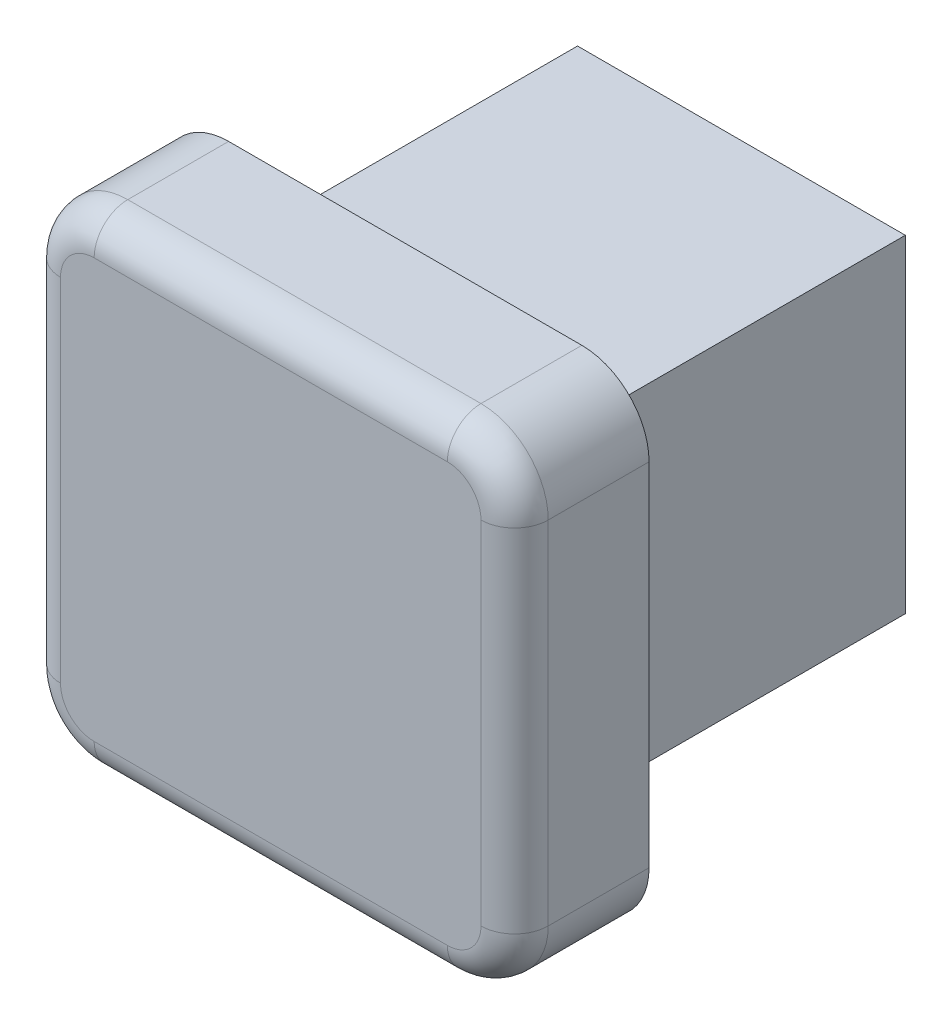
ISO-10303-21;
HEADER;
FILE_DESCRIPTION(('STEP AP214'),'2;1');
FILE_NAME('part.step','',(''),(''),'','','');
FILE_SCHEMA(('AUTOMOTIVE_DESIGN { 1 0 10303 214 1 1 1 1 }'));
ENDSEC;
DATA;
#1=APPLICATION_CONTEXT('core data for automotive mechanical design processes');
#2=APPLICATION_PROTOCOL_DEFINITION('international standard','automotive_design',2000,#1);
#3=PRODUCT_CONTEXT('',#1,'mechanical');
#4=PRODUCT('Part','Part','',(#3));
#5=PRODUCT_RELATED_PRODUCT_CATEGORY('part','',(#4));
#6=PRODUCT_DEFINITION_FORMATION('','',#4);
#7=PRODUCT_DEFINITION_CONTEXT('part definition',#1,'design');
#8=PRODUCT_DEFINITION('design','',#6,#7);
#9=PRODUCT_DEFINITION_SHAPE('','',#8);
#10=(LENGTH_UNIT() NAMED_UNIT(*) SI_UNIT(.MILLI.,.METRE.));
#11=(NAMED_UNIT(*) PLANE_ANGLE_UNIT() SI_UNIT($,.RADIAN.));
#12=(NAMED_UNIT(*) SI_UNIT($,.STERADIAN.) SOLID_ANGLE_UNIT());
#13=UNCERTAINTY_MEASURE_WITH_UNIT(LENGTH_MEASURE(1.E-05),#10,'distance_accuracy_value','');
#14=(GEOMETRIC_REPRESENTATION_CONTEXT(3) GLOBAL_UNCERTAINTY_ASSIGNED_CONTEXT((#13)) GLOBAL_UNIT_ASSIGNED_CONTEXT((#10,
#11,#12)) REPRESENTATION_CONTEXT('',''));
#15=CARTESIAN_POINT('',(0.,0.,0.));
#16=DIRECTION('',(0.,0.,1.));
#17=DIRECTION('',(1.,0.,0.));
#18=AXIS2_PLACEMENT_3D('',#15,#16,#17);
#19=CARTESIAN_POINT('',(0.,0.,0.));
#20=DIRECTION('',(0.,0.,1.));
#21=DIRECTION('',(1.,0.,0.));
#22=AXIS2_PLACEMENT_3D('',#19,#20,#21);
#23=PLANE('',#22);
#24=DIRECTION('',(0.,-1.,0.));
#25=VECTOR('',#24,1.);
#26=CARTESIAN_POINT('',(-4.875,4.875,0.));
#27=LINE('',#26,#25);
#28=CARTESIAN_POINT('',(-4.875,4.875,0.));
#29=VERTEX_POINT('',#28);
#30=CARTESIAN_POINT('',(-4.875,-4.875,0.));
#31=VERTEX_POINT('',#30);
#32=EDGE_CURVE('E280',#29,#31,#27,.T.);
#33=ORIENTED_EDGE('',*,*,#32,.F.);
#34=DIRECTION('',(1.,0.,0.));
#35=VECTOR('',#34,1.);
#36=CARTESIAN_POINT('',(-4.875,4.875,0.));
#37=LINE('',#36,#35);
#38=CARTESIAN_POINT('',(4.875,4.875,0.));
#39=VERTEX_POINT('',#38);
#40=EDGE_CURVE('E284',#29,#39,#37,.T.);
#41=ORIENTED_EDGE('',*,*,#40,.T.);
#42=DIRECTION('',(0.,-1.,0.));
#43=VECTOR('',#42,1.);
#44=CARTESIAN_POINT('',(4.875,4.875,0.));
#45=LINE('',#44,#43);
#46=CARTESIAN_POINT('',(4.875,-4.875,0.));
#47=VERTEX_POINT('',#46);
#48=EDGE_CURVE('E298',#39,#47,#45,.T.);
#49=ORIENTED_EDGE('',*,*,#48,.T.);
#50=DIRECTION('',(1.,0.,0.));
#51=VECTOR('',#50,1.);
#52=CARTESIAN_POINT('',(-4.875,-4.875,0.));
#53=LINE('',#52,#51);
#54=EDGE_CURVE('E295',#31,#47,#53,.T.);
#55=ORIENTED_EDGE('',*,*,#54,.F.);
#56=EDGE_LOOP('',(#33,#41,#49,#55));
#57=FACE_BOUND('',#56,.T.);
#58=DIRECTION('',(0.,-1.,0.));
#59=VECTOR('',#58,1.);
#60=CARTESIAN_POINT('',(-3.875,3.875,0.));
#61=LINE('',#60,#59);
#62=CARTESIAN_POINT('',(-3.875,3.875,0.));
#63=VERTEX_POINT('',#62);
#64=CARTESIAN_POINT('',(-3.875,-3.875,0.));
#65=VERTEX_POINT('',#64);
#66=EDGE_CURVE('E201',#63,#65,#61,.T.);
#67=ORIENTED_EDGE('',*,*,#66,.T.);
#68=DIRECTION('',(1.,0.,0.));
#69=VECTOR('',#68,1.);
#70=CARTESIAN_POINT('',(-3.875,-3.875,0.));
#71=LINE('',#70,#69);
#72=CARTESIAN_POINT('',(3.875,-3.875,0.));
#73=VERTEX_POINT('',#72);
#74=EDGE_CURVE('E263',#65,#73,#71,.T.);
#75=ORIENTED_EDGE('',*,*,#74,.T.);
#76=DIRECTION('',(0.,-1.,0.));
#77=VECTOR('',#76,1.);
#78=CARTESIAN_POINT('',(3.875,3.875,0.));
#79=LINE('',#78,#77);
#80=CARTESIAN_POINT('',(3.875,3.875,0.));
#81=VERTEX_POINT('',#80);
#82=EDGE_CURVE('E266',#81,#73,#79,.T.);
#83=ORIENTED_EDGE('',*,*,#82,.F.);
#84=DIRECTION('',(1.,0.,0.));
#85=VECTOR('',#84,1.);
#86=CARTESIAN_POINT('',(-3.875,3.875,0.));
#87=LINE('',#86,#85);
#88=EDGE_CURVE('E251',#63,#81,#87,.T.);
#89=ORIENTED_EDGE('',*,*,#88,.F.);
#90=EDGE_LOOP('',(#67,#75,#83,#89));
#91=FACE_BOUND('',#90,.T.);
#92=ADVANCED_FACE('F57',(#57,#91),#23,.F.);
#93=CARTESIAN_POINT('',(-4.875,4.875,10.));
#94=DIRECTION('',(1.,0.,0.));
#95=DIRECTION('',(0.,1.,0.));
#96=AXIS2_PLACEMENT_3D('',#93,#94,#95);
#97=PLANE('',#96);
#98=ORIENTED_EDGE('',*,*,#32,.T.);
#99=DIRECTION('',(0.,0.,-1.));
#100=VECTOR('',#99,1.);
#101=CARTESIAN_POINT('',(-4.875,-4.875,10.));
#102=LINE('',#101,#100);
#103=CARTESIAN_POINT('',(-4.875,-4.875,10.));
#104=VERTEX_POINT('',#103);
#105=EDGE_CURVE('E308',#104,#31,#102,.T.);
#106=ORIENTED_EDGE('',*,*,#105,.F.);
#107=DIRECTION('',(0.,-1.,0.));
#108=VECTOR('',#107,1.);
#109=CARTESIAN_POINT('',(-4.875,4.875,10.));
#110=LINE('',#109,#108);
#111=CARTESIAN_POINT('',(-4.875,4.875,10.));
#112=VERTEX_POINT('',#111);
#113=EDGE_CURVE('E281',#112,#104,#110,.T.);
#114=ORIENTED_EDGE('',*,*,#113,.F.);
#115=DIRECTION('',(0.,0.,-1.));
#116=VECTOR('',#115,1.);
#117=CARTESIAN_POINT('',(-4.875,4.875,10.));
#118=LINE('',#117,#116);
#119=EDGE_CURVE('E292',#112,#29,#118,.T.);
#120=ORIENTED_EDGE('',*,*,#119,.T.);
#121=EDGE_LOOP('',(#98,#106,#114,#120));
#122=FACE_BOUND('',#121,.T.);
#123=ADVANCED_FACE('F422',(#122),#97,.F.);
#124=CARTESIAN_POINT('',(-4.875,-4.875,10.));
#125=DIRECTION('',(0.,1.,0.));
#126=DIRECTION('',(-1.,0.,0.));
#127=AXIS2_PLACEMENT_3D('',#124,#125,#126);
#128=PLANE('',#127);
#129=ORIENTED_EDGE('',*,*,#54,.T.);
#130=DIRECTION('',(0.,0.,-1.));
#131=VECTOR('',#130,1.);
#132=CARTESIAN_POINT('',(4.875,-4.875,10.));
#133=LINE('',#132,#131);
#134=CARTESIAN_POINT('',(4.875,-4.875,10.));
#135=VERTEX_POINT('',#134);
#136=EDGE_CURVE('E306',#135,#47,#133,.T.);
#137=ORIENTED_EDGE('',*,*,#136,.F.);
#138=DIRECTION('',(1.,0.,0.));
#139=VECTOR('',#138,1.);
#140=CARTESIAN_POINT('',(-4.875,-4.875,10.));
#141=LINE('',#140,#139);
#142=EDGE_CURVE('E283',#104,#135,#141,.T.);
#143=ORIENTED_EDGE('',*,*,#142,.F.);
#144=ORIENTED_EDGE('',*,*,#105,.T.);
#145=EDGE_LOOP('',(#129,#137,#143,#144));
#146=FACE_BOUND('',#145,.T.);
#147=ADVANCED_FACE('F428',(#146),#128,.F.);
#148=CARTESIAN_POINT('',(4.875,4.875,10.));
#149=DIRECTION('',(1.,0.,0.));
#150=DIRECTION('',(0.,0.,-1.));
#151=AXIS2_PLACEMENT_3D('',#148,#149,#150);
#152=PLANE('',#151);
#153=ORIENTED_EDGE('',*,*,#48,.F.);
#154=DIRECTION('',(0.,0.,-1.));
#155=VECTOR('',#154,1.);
#156=CARTESIAN_POINT('',(4.875,4.875,10.));
#157=LINE('',#156,#155);
#158=CARTESIAN_POINT('',(4.875,4.875,10.));
#159=VERTEX_POINT('',#158);
#160=EDGE_CURVE('E304',#159,#39,#157,.T.);
#161=ORIENTED_EDGE('',*,*,#160,.F.);
#162=DIRECTION('',(0.,-1.,0.));
#163=VECTOR('',#162,1.);
#164=CARTESIAN_POINT('',(4.875,4.875,10.));
#165=LINE('',#164,#163);
#166=EDGE_CURVE('E286',#159,#135,#165,.T.);
#167=ORIENTED_EDGE('',*,*,#166,.T.);
#168=ORIENTED_EDGE('',*,*,#136,.T.);
#169=EDGE_LOOP('',(#153,#161,#167,#168));
#170=FACE_BOUND('',#169,.T.);
#171=ADVANCED_FACE('F440',(#170),#152,.T.);
#172=CARTESIAN_POINT('',(-4.875,4.875,10.));
#173=DIRECTION('',(0.,1.,0.));
#174=DIRECTION('',(0.,0.,1.));
#175=AXIS2_PLACEMENT_3D('',#172,#173,#174);
#176=PLANE('',#175);
#177=ORIENTED_EDGE('',*,*,#40,.F.);
#178=ORIENTED_EDGE('',*,*,#119,.F.);
#179=DIRECTION('',(1.,0.,0.));
#180=VECTOR('',#179,1.);
#181=CARTESIAN_POINT('',(-4.875,4.875,10.));
#182=LINE('',#181,#180);
#183=EDGE_CURVE('E289',#112,#159,#182,.T.);
#184=ORIENTED_EDGE('',*,*,#183,.T.);
#185=ORIENTED_EDGE('',*,*,#160,.T.);
#186=EDGE_LOOP('',(#177,#178,#184,#185));
#187=FACE_BOUND('',#186,.T.);
#188=ADVANCED_FACE('F437',(#187),#176,.T.);
#189=CARTESIAN_POINT('',(-3.875,3.875,10.));
#190=DIRECTION('',(1.,0.,0.));
#191=DIRECTION('',(0.,1.,0.));
#192=AXIS2_PLACEMENT_3D('',#189,#190,#191);
#193=PLANE('',#192);
#194=ORIENTED_EDGE('',*,*,#66,.F.);
#195=DIRECTION('',(0.,0.,-1.));
#196=VECTOR('',#195,1.);
#197=CARTESIAN_POINT('',(-3.875,3.875,10.));
#198=LINE('',#197,#196);
#199=CARTESIAN_POINT('',(-3.875,3.875,10.));
#200=VERTEX_POINT('',#199);
#201=EDGE_CURVE('E260',#200,#63,#198,.T.);
#202=ORIENTED_EDGE('',*,*,#201,.F.);
#203=DIRECTION('',(0.,-1.,0.));
#204=VECTOR('',#203,1.);
#205=CARTESIAN_POINT('',(-3.875,3.875,10.));
#206=LINE('',#205,#204);
#207=CARTESIAN_POINT('',(-3.875,-3.875,10.));
#208=VERTEX_POINT('',#207);
#209=EDGE_CURVE('E248',#200,#208,#206,.T.);
#210=ORIENTED_EDGE('',*,*,#209,.T.);
#211=DIRECTION('',(0.,0.,-1.));
#212=VECTOR('',#211,1.);
#213=CARTESIAN_POINT('',(-3.875,-3.875,10.));
#214=LINE('',#213,#212);
#215=EDGE_CURVE('E277',#208,#65,#214,.T.);
#216=ORIENTED_EDGE('',*,*,#215,.T.);
#217=EDGE_LOOP('',(#194,#202,#210,#216));
#218=FACE_BOUND('',#217,.T.);
#219=ADVANCED_FACE('F435',(#218),#193,.T.);
#220=CARTESIAN_POINT('',(-3.875,-3.875,10.));
#221=DIRECTION('',(0.,1.,0.));
#222=DIRECTION('',(0.,0.,1.));
#223=AXIS2_PLACEMENT_3D('',#220,#221,#222);
#224=PLANE('',#223);
#225=ORIENTED_EDGE('',*,*,#74,.F.);
#226=ORIENTED_EDGE('',*,*,#215,.F.);
#227=DIRECTION('',(1.,0.,0.));
#228=VECTOR('',#227,1.);
#229=CARTESIAN_POINT('',(-3.875,-3.875,10.));
#230=LINE('',#229,#228);
#231=CARTESIAN_POINT('',(3.875,-3.875,10.));
#232=VERTEX_POINT('',#231);
#233=EDGE_CURVE('E250',#208,#232,#230,.T.);
#234=ORIENTED_EDGE('',*,*,#233,.T.);
#235=DIRECTION('',(0.,0.,-1.));
#236=VECTOR('',#235,1.);
#237=CARTESIAN_POINT('',(3.875,-3.875,10.));
#238=LINE('',#237,#236);
#239=EDGE_CURVE('E275',#232,#73,#238,.T.);
#240=ORIENTED_EDGE('',*,*,#239,.T.);
#241=EDGE_LOOP('',(#225,#226,#234,#240));
#242=FACE_BOUND('',#241,.T.);
#243=ADVANCED_FACE('F489',(#242),#224,.T.);
#244=CARTESIAN_POINT('',(3.875,3.875,10.));
#245=DIRECTION('',(1.,0.,0.));
#246=DIRECTION('',(0.,1.,0.));
#247=AXIS2_PLACEMENT_3D('',#244,#245,#246);
#248=PLANE('',#247);
#249=ORIENTED_EDGE('',*,*,#82,.T.);
#250=ORIENTED_EDGE('',*,*,#239,.F.);
#251=DIRECTION('',(0.,-1.,0.));
#252=VECTOR('',#251,1.);
#253=CARTESIAN_POINT('',(3.875,3.875,10.));
#254=LINE('',#253,#252);
#255=CARTESIAN_POINT('',(3.875,3.875,10.));
#256=VERTEX_POINT('',#255);
#257=EDGE_CURVE('E254',#256,#232,#254,.T.);
#258=ORIENTED_EDGE('',*,*,#257,.F.);
#259=DIRECTION('',(0.,0.,-1.));
#260=VECTOR('',#259,1.);
#261=CARTESIAN_POINT('',(3.875,3.875,10.));
#262=LINE('',#261,#260);
#263=EDGE_CURVE('E273',#256,#81,#262,.T.);
#264=ORIENTED_EDGE('',*,*,#263,.T.);
#265=EDGE_LOOP('',(#249,#250,#258,#264));
#266=FACE_BOUND('',#265,.T.);
#267=ADVANCED_FACE('F482',(#266),#248,.F.);
#268=CARTESIAN_POINT('',(-3.875,3.875,10.));
#269=DIRECTION('',(0.,1.,0.));
#270=DIRECTION('',(0.,0.,1.));
#271=AXIS2_PLACEMENT_3D('',#268,#269,#270);
#272=PLANE('',#271);
#273=ORIENTED_EDGE('',*,*,#88,.T.);
#274=ORIENTED_EDGE('',*,*,#263,.F.);
#275=DIRECTION('',(1.,0.,0.));
#276=VECTOR('',#275,1.);
#277=CARTESIAN_POINT('',(-3.875,3.875,10.));
#278=LINE('',#277,#276);
#279=EDGE_CURVE('E257',#200,#256,#278,.T.);
#280=ORIENTED_EDGE('',*,*,#279,.F.);
#281=ORIENTED_EDGE('',*,*,#201,.T.);
#282=EDGE_LOOP('',(#273,#274,#280,#281));
#283=FACE_BOUND('',#282,.T.);
#284=ADVANCED_FACE('F475',(#283),#272,.F.);
#285=CARTESIAN_POINT('',(5.25316108936624,5.22871627776556,10.));
#286=DIRECTION('',(0.,0.,-1.));
#287=DIRECTION('',(-1.,0.,0.));
#288=AXIS2_PLACEMENT_3D('',#285,#286,#287);
#289=PLANE('',#288);
#290=ORIENTED_EDGE('',*,*,#233,.F.);
#291=ORIENTED_EDGE('',*,*,#209,.F.);
#292=ORIENTED_EDGE('',*,*,#279,.T.);
#293=ORIENTED_EDGE('',*,*,#257,.T.);
#294=EDGE_LOOP('',(#290,#291,#292,#293));
#295=FACE_BOUND('',#294,.T.);
#296=ADVANCED_FACE('F468',(#295),#289,.T.);
#297=CARTESIAN_POINT('',(5.25316108936624,5.22871627776556,14.));
#298=DIRECTION('',(0.,0.,-1.));
#299=DIRECTION('',(-1.,0.,0.));
#300=AXIS2_PLACEMENT_3D('',#297,#298,#299);
#301=CYLINDRICAL_SURFACE('',#300,2.);
#302=DIRECTION('',(0.,0.,-1.));
#303=VECTOR('',#302,1.);
#304=CARTESIAN_POINT('',(5.25316108936623,7.22871627776556,14.));
#305=LINE('',#304,#303);
#306=CARTESIAN_POINT('',(5.25316108936623,7.22871627776556,13.));
#307=VERTEX_POINT('',#306);
#308=CARTESIAN_POINT('',(5.25316108936623,7.22871627776556,10.));
#309=VERTEX_POINT('',#308);
#310=EDGE_CURVE('E193',#307,#309,#305,.T.);
#311=ORIENTED_EDGE('',*,*,#310,.F.);
#312=CARTESIAN_POINT('',(5.25316108936624,5.22871627776556,13.));
#313=DIRECTION('',(0.,0.,-1.));
#314=DIRECTION('',(-1.,0.,0.));
#315=AXIS2_PLACEMENT_3D('',#312,#313,#314);
#316=CIRCLE('',#315,2.);
#317=CARTESIAN_POINT('',(7.25316108936624,5.22871627776554,13.));
#318=VERTEX_POINT('',#317);
#319=EDGE_CURVE('E12',#307,#318,#316,.T.);
#320=ORIENTED_EDGE('',*,*,#319,.T.);
#321=DIRECTION('',(0.,0.,-1.));
#322=VECTOR('',#321,1.);
#323=CARTESIAN_POINT('',(7.25316108936624,5.22871627776554,14.));
#324=LINE('',#323,#322);
#325=CARTESIAN_POINT('',(7.25316108936624,5.22871627776554,10.));
#326=VERTEX_POINT('',#325);
#327=EDGE_CURVE('E215',#318,#326,#324,.T.);
#328=ORIENTED_EDGE('',*,*,#327,.T.);
#329=CARTESIAN_POINT('',(5.25316108936624,5.22871627776556,10.));
#330=DIRECTION('',(0.,0.,1.));
#331=DIRECTION('',(-1.,0.,0.));
#332=AXIS2_PLACEMENT_3D('',#329,#330,#331);
#333=CIRCLE('',#332,2.);
#334=EDGE_CURVE('E208',#326,#309,#333,.T.);
#335=ORIENTED_EDGE('',*,*,#334,.T.);
#336=EDGE_LOOP('',(#311,#320,#328,#335));
#337=FACE_BOUND('',#336,.T.);
#338=ADVANCED_FACE('F213',(#337),#301,.T.);
#339=CARTESIAN_POINT('',(-5.25316108936623,7.22871627776556,14.));
#340=DIRECTION('',(0.,-1.,0.));
#341=DIRECTION('',(0.,0.,-1.));
#342=AXIS2_PLACEMENT_3D('',#339,#340,#341);
#343=PLANE('',#342);
#344=DIRECTION('',(0.,0.,-1.));
#345=VECTOR('',#344,1.);
#346=CARTESIAN_POINT('',(-5.25316108936623,7.22871627776556,14.));
#347=LINE('',#346,#345);
#348=CARTESIAN_POINT('',(-5.25316108936623,7.22871627776556,13.));
#349=VERTEX_POINT('',#348);
#350=CARTESIAN_POINT('',(-5.25316108936623,7.22871627776556,10.));
#351=VERTEX_POINT('',#350);
#352=EDGE_CURVE('E202',#349,#351,#347,.T.);
#353=ORIENTED_EDGE('',*,*,#352,.F.);
#354=DIRECTION('',(-1.,0.,0.));
#355=VECTOR('',#354,1.);
#356=CARTESIAN_POINT('',(-5.25316108936623,7.22871627776556,13.));
#357=LINE('',#356,#355);
#358=EDGE_CURVE('E66',#349,#307,#357,.F.);
#359=ORIENTED_EDGE('',*,*,#358,.T.);
#360=ORIENTED_EDGE('',*,*,#310,.T.);
#361=DIRECTION('',(-1.,0.,0.));
#362=VECTOR('',#361,1.);
#363=CARTESIAN_POINT('',(-5.25316108936623,7.22871627776556,10.));
#364=LINE('',#363,#362);
#365=EDGE_CURVE('E196',#309,#351,#364,.T.);
#366=ORIENTED_EDGE('',*,*,#365,.T.);
#367=EDGE_LOOP('',(#353,#359,#360,#366));
#368=FACE_BOUND('',#367,.T.);
#369=ADVANCED_FACE('F195',(#368),#343,.F.);
#370=CARTESIAN_POINT('',(-5.25316108936624,5.22871627776556,14.));
#371=DIRECTION('',(0.,0.,-1.));
#372=DIRECTION('',(-1.,0.,0.));
#373=AXIS2_PLACEMENT_3D('',#370,#371,#372);
#374=CYLINDRICAL_SURFACE('',#373,2.);
#375=DIRECTION('',(0.,0.,-1.));
#376=VECTOR('',#375,1.);
#377=CARTESIAN_POINT('',(-7.25316108936624,5.22871627776554,14.));
#378=LINE('',#377,#376);
#379=CARTESIAN_POINT('',(-7.25316108936624,5.22871627776554,13.));
#380=VERTEX_POINT('',#379);
#381=CARTESIAN_POINT('',(-7.25316108936624,5.22871627776554,10.));
#382=VERTEX_POINT('',#381);
#383=EDGE_CURVE('E245',#380,#382,#378,.T.);
#384=ORIENTED_EDGE('',*,*,#383,.F.);
#385=CARTESIAN_POINT('',(-5.25316108936624,5.22871627776556,13.));
#386=DIRECTION('',(0.,0.,-1.));
#387=DIRECTION('',(-1.,0.,0.));
#388=AXIS2_PLACEMENT_3D('',#385,#386,#387);
#389=CIRCLE('',#388,2.);
#390=EDGE_CURVE('E81',#380,#349,#389,.T.);
#391=ORIENTED_EDGE('',*,*,#390,.T.);
#392=ORIENTED_EDGE('',*,*,#352,.T.);
#393=CARTESIAN_POINT('',(-5.25316108936624,5.22871627776556,10.));
#394=DIRECTION('',(0.,0.,1.));
#395=DIRECTION('',(1.,0.,0.));
#396=AXIS2_PLACEMENT_3D('',#393,#394,#395);
#397=CIRCLE('',#396,2.);
#398=EDGE_CURVE('E211',#351,#382,#397,.T.);
#399=ORIENTED_EDGE('',*,*,#398,.T.);
#400=EDGE_LOOP('',(#384,#391,#392,#399));
#401=FACE_BOUND('',#400,.T.);
#402=ADVANCED_FACE('F412',(#401),#374,.T.);
#403=CARTESIAN_POINT('',(-7.25316108936624,5.22871627776554,14.));
#404=DIRECTION('',(1.,0.,0.));
#405=DIRECTION('',(0.,0.,-1.));
#406=AXIS2_PLACEMENT_3D('',#403,#404,#405);
#407=PLANE('',#406);
#408=DIRECTION('',(0.,0.,-1.));
#409=VECTOR('',#408,1.);
#410=CARTESIAN_POINT('',(-7.25316108936624,-5.22871627776554,14.));
#411=LINE('',#410,#409);
#412=CARTESIAN_POINT('',(-7.25316108936624,-5.22871627776554,13.));
#413=VERTEX_POINT('',#412);
#414=CARTESIAN_POINT('',(-7.25316108936624,-5.22871627776554,10.));
#415=VERTEX_POINT('',#414);
#416=EDGE_CURVE('E243',#413,#415,#411,.T.);
#417=ORIENTED_EDGE('',*,*,#416,.F.);
#418=DIRECTION('',(0.,-1.,0.));
#419=VECTOR('',#418,1.);
#420=CARTESIAN_POINT('',(-7.25316108936624,5.22871627776554,13.));
#421=LINE('',#420,#419);
#422=EDGE_CURVE('E337',#413,#380,#421,.F.);
#423=ORIENTED_EDGE('',*,*,#422,.T.);
#424=ORIENTED_EDGE('',*,*,#383,.T.);
#425=DIRECTION('',(0.,-1.,0.));
#426=VECTOR('',#425,1.);
#427=CARTESIAN_POINT('',(-7.25316108936624,5.22871627776554,10.));
#428=LINE('',#427,#426);
#429=EDGE_CURVE('E222',#382,#415,#428,.T.);
#430=ORIENTED_EDGE('',*,*,#429,.T.);
#431=EDGE_LOOP('',(#417,#423,#424,#430));
#432=FACE_BOUND('',#431,.T.);
#433=ADVANCED_FACE('F410',(#432),#407,.F.);
#434=CARTESIAN_POINT('',(-5.25316108936624,-5.22871627776556,14.));
#435=DIRECTION('',(0.,0.,-1.));
#436=DIRECTION('',(-1.,0.,0.));
#437=AXIS2_PLACEMENT_3D('',#434,#435,#436);
#438=CYLINDRICAL_SURFACE('',#437,2.);
#439=DIRECTION('',(0.,0.,-1.));
#440=VECTOR('',#439,1.);
#441=CARTESIAN_POINT('',(-5.25316108936623,-7.22871627776556,14.));
#442=LINE('',#441,#440);
#443=CARTESIAN_POINT('',(-5.25316108936623,-7.22871627776556,13.));
#444=VERTEX_POINT('',#443);
#445=CARTESIAN_POINT('',(-5.25316108936623,-7.22871627776556,10.));
#446=VERTEX_POINT('',#445);
#447=EDGE_CURVE('E241',#444,#446,#442,.T.);
#448=ORIENTED_EDGE('',*,*,#447,.F.);
#449=CARTESIAN_POINT('',(-5.25316108936624,-5.22871627776556,13.));
#450=DIRECTION('',(0.,0.,-1.));
#451=DIRECTION('',(-1.,0.,0.));
#452=AXIS2_PLACEMENT_3D('',#449,#450,#451);
#453=CIRCLE('',#452,2.);
#454=EDGE_CURVE('E335',#444,#413,#453,.T.);
#455=ORIENTED_EDGE('',*,*,#454,.T.);
#456=ORIENTED_EDGE('',*,*,#416,.T.);
#457=CARTESIAN_POINT('',(-5.25316108936624,-5.22871627776556,10.));
#458=DIRECTION('',(0.,0.,1.));
#459=DIRECTION('',(1.,0.,0.));
#460=AXIS2_PLACEMENT_3D('',#457,#458,#459);
#461=CIRCLE('',#460,2.);
#462=EDGE_CURVE('E225',#415,#446,#461,.T.);
#463=ORIENTED_EDGE('',*,*,#462,.T.);
#464=EDGE_LOOP('',(#448,#455,#456,#463));
#465=FACE_BOUND('',#464,.T.);
#466=ADVANCED_FACE('F408',(#465),#438,.T.);
#467=CARTESIAN_POINT('',(-5.25316108936623,-7.22871627776556,14.));
#468=DIRECTION('',(0.,1.,0.));
#469=DIRECTION('',(0.,0.,1.));
#470=AXIS2_PLACEMENT_3D('',#467,#468,#469);
#471=PLANE('',#470);
#472=DIRECTION('',(0.,0.,-1.));
#473=VECTOR('',#472,1.);
#474=CARTESIAN_POINT('',(5.25316108936623,-7.22871627776556,14.));
#475=LINE('',#474,#473);
#476=CARTESIAN_POINT('',(5.25316108936623,-7.22871627776556,13.));
#477=VERTEX_POINT('',#476);
#478=CARTESIAN_POINT('',(5.25316108936623,-7.22871627776556,10.));
#479=VERTEX_POINT('',#478);
#480=EDGE_CURVE('E239',#477,#479,#475,.T.);
#481=ORIENTED_EDGE('',*,*,#480,.F.);
#482=DIRECTION('',(1.,0.,0.));
#483=VECTOR('',#482,1.);
#484=CARTESIAN_POINT('',(-5.25316108936623,-7.22871627776556,13.));
#485=LINE('',#484,#483);
#486=EDGE_CURVE('E333',#477,#444,#485,.F.);
#487=ORIENTED_EDGE('',*,*,#486,.T.);
#488=ORIENTED_EDGE('',*,*,#447,.T.);
#489=DIRECTION('',(1.,0.,0.));
#490=VECTOR('',#489,1.);
#491=CARTESIAN_POINT('',(-5.25316108936623,-7.22871627776556,10.));
#492=LINE('',#491,#490);
#493=EDGE_CURVE('E228',#446,#479,#492,.T.);
#494=ORIENTED_EDGE('',*,*,#493,.T.);
#495=EDGE_LOOP('',(#481,#487,#488,#494));
#496=FACE_BOUND('',#495,.T.);
#497=ADVANCED_FACE('F396',(#496),#471,.F.);
#498=CARTESIAN_POINT('',(5.25316108936624,-5.22871627776556,14.));
#499=DIRECTION('',(0.,0.,-1.));
#500=DIRECTION('',(-1.,0.,0.));
#501=AXIS2_PLACEMENT_3D('',#498,#499,#500);
#502=CYLINDRICAL_SURFACE('',#501,2.);
#503=DIRECTION('',(0.,0.,-1.));
#504=VECTOR('',#503,1.);
#505=CARTESIAN_POINT('',(7.25316108936624,-5.22871627776556,14.));
#506=LINE('',#505,#504);
#507=CARTESIAN_POINT('',(7.25316108936624,-5.22871627776556,13.));
#508=VERTEX_POINT('',#507);
#509=CARTESIAN_POINT('',(7.25316108936624,-5.22871627776556,10.));
#510=VERTEX_POINT('',#509);
#511=EDGE_CURVE('E237',#508,#510,#506,.T.);
#512=ORIENTED_EDGE('',*,*,#511,.F.);
#513=CARTESIAN_POINT('',(5.25316108936624,-5.22871627776556,13.));
#514=DIRECTION('',(0.,0.,-1.));
#515=DIRECTION('',(-1.,0.,0.));
#516=AXIS2_PLACEMENT_3D('',#513,#514,#515);
#517=CIRCLE('',#516,2.);
#518=EDGE_CURVE('E331',#508,#477,#517,.T.);
#519=ORIENTED_EDGE('',*,*,#518,.T.);
#520=ORIENTED_EDGE('',*,*,#480,.T.);
#521=CARTESIAN_POINT('',(5.25316108936624,-5.22871627776556,10.));
#522=DIRECTION('',(0.,0.,1.));
#523=DIRECTION('',(1.,0.,0.));
#524=AXIS2_PLACEMENT_3D('',#521,#522,#523);
#525=CIRCLE('',#524,2.);
#526=EDGE_CURVE('E231',#479,#510,#525,.T.);
#527=ORIENTED_EDGE('',*,*,#526,.T.);
#528=EDGE_LOOP('',(#512,#519,#520,#527));
#529=FACE_BOUND('',#528,.T.);
#530=ADVANCED_FACE('F393',(#529),#502,.T.);
#531=CARTESIAN_POINT('',(7.25316108936624,5.22871627776554,14.));
#532=DIRECTION('',(-1.,0.,0.));
#533=DIRECTION('',(0.,0.,1.));
#534=AXIS2_PLACEMENT_3D('',#531,#532,#533);
#535=PLANE('',#534);
#536=ORIENTED_EDGE('',*,*,#327,.F.);
#537=DIRECTION('',(0.,1.,0.));
#538=VECTOR('',#537,1.);
#539=CARTESIAN_POINT('',(7.25316108936624,5.22871627776554,13.));
#540=LINE('',#539,#538);
#541=EDGE_CURVE('E328',#318,#508,#540,.F.);
#542=ORIENTED_EDGE('',*,*,#541,.T.);
#543=ORIENTED_EDGE('',*,*,#511,.T.);
#544=DIRECTION('',(0.,1.,0.));
#545=VECTOR('',#544,1.);
#546=CARTESIAN_POINT('',(7.25316108936624,5.22871627776554,10.));
#547=LINE('',#546,#545);
#548=EDGE_CURVE('E234',#510,#326,#547,.T.);
#549=ORIENTED_EDGE('',*,*,#548,.T.);
#550=EDGE_LOOP('',(#536,#542,#543,#549));
#551=FACE_BOUND('',#550,.T.);
#552=ADVANCED_FACE('F380',(#551),#535,.F.);
#553=CARTESIAN_POINT('',(5.25316108936624,5.22871627776556,14.));
#554=DIRECTION('',(0.,0.,-1.));
#555=DIRECTION('',(-1.,0.,0.));
#556=AXIS2_PLACEMENT_3D('',#553,#554,#555);
#557=PLANE('',#556);
#558=CARTESIAN_POINT('',(5.25316108936624,-5.22871627776556,14.));
#559=DIRECTION('',(0.,0.,-1.));
#560=DIRECTION('',(-1.,0.,0.));
#561=AXIS2_PLACEMENT_3D('',#558,#559,#560);
#562=CIRCLE('',#561,1.);
#563=CARTESIAN_POINT('',(5.25316108936624,-6.22871627776556,14.));
#564=VERTEX_POINT('',#563);
#565=CARTESIAN_POINT('',(6.25316108936624,-5.22871627776556,14.));
#566=VERTEX_POINT('',#565);
#567=EDGE_CURVE('E323',#564,#566,#562,.F.);
#568=ORIENTED_EDGE('',*,*,#567,.T.);
#569=DIRECTION('',(0.,1.,0.));
#570=VECTOR('',#569,1.);
#571=CARTESIAN_POINT('',(6.25316108936624,5.22871627776556,14.));
#572=LINE('',#571,#570);
#573=CARTESIAN_POINT('',(6.25316108936624,5.22871627776554,14.));
#574=VERTEX_POINT('',#573);
#575=EDGE_CURVE('E325',#566,#574,#572,.T.);
#576=ORIENTED_EDGE('',*,*,#575,.T.);
#577=CARTESIAN_POINT('',(5.25316108936624,5.22871627776556,14.));
#578=DIRECTION('',(0.,0.,-1.));
#579=DIRECTION('',(-1.,0.,0.));
#580=AXIS2_PLACEMENT_3D('',#577,#578,#579);
#581=CIRCLE('',#580,1.);
#582=CARTESIAN_POINT('',(5.25316108936623,6.22871627776556,14.));
#583=VERTEX_POINT('',#582);
#584=EDGE_CURVE('E311',#574,#583,#581,.F.);
#585=ORIENTED_EDGE('',*,*,#584,.T.);
#586=DIRECTION('',(-1.,0.,0.));
#587=VECTOR('',#586,1.);
#588=CARTESIAN_POINT('',(5.25316108936624,6.22871627776556,14.));
#589=LINE('',#588,#587);
#590=CARTESIAN_POINT('',(-5.25316108936624,6.22871627776556,14.));
#591=VERTEX_POINT('',#590);
#592=EDGE_CURVE('E313',#583,#591,#589,.T.);
#593=ORIENTED_EDGE('',*,*,#592,.T.);
#594=CARTESIAN_POINT('',(-5.25316108936624,5.22871627776556,14.));
#595=DIRECTION('',(0.,0.,-1.));
#596=DIRECTION('',(-1.,0.,0.));
#597=AXIS2_PLACEMENT_3D('',#594,#595,#596);
#598=CIRCLE('',#597,1.);
#599=CARTESIAN_POINT('',(-6.25316108936624,5.22871627776554,14.));
#600=VERTEX_POINT('',#599);
#601=EDGE_CURVE('E315',#591,#600,#598,.F.);
#602=ORIENTED_EDGE('',*,*,#601,.T.);
#603=DIRECTION('',(0.,-1.,0.));
#604=VECTOR('',#603,1.);
#605=CARTESIAN_POINT('',(-6.25316108936625,5.22871627776556,14.));
#606=LINE('',#605,#604);
#607=CARTESIAN_POINT('',(-6.25316108936625,-5.22871627776555,14.));
#608=VERTEX_POINT('',#607);
#609=EDGE_CURVE('E317',#600,#608,#606,.T.);
#610=ORIENTED_EDGE('',*,*,#609,.T.);
#611=CARTESIAN_POINT('',(-5.25316108936624,-5.22871627776556,14.));
#612=DIRECTION('',(0.,0.,-1.));
#613=DIRECTION('',(-1.,0.,0.));
#614=AXIS2_PLACEMENT_3D('',#611,#612,#613);
#615=CIRCLE('',#614,1.);
#616=CARTESIAN_POINT('',(-5.25316108936623,-6.22871627776556,14.));
#617=VERTEX_POINT('',#616);
#618=EDGE_CURVE('E319',#608,#617,#615,.F.);
#619=ORIENTED_EDGE('',*,*,#618,.T.);
#620=DIRECTION('',(1.,0.,0.));
#621=VECTOR('',#620,1.);
#622=CARTESIAN_POINT('',(5.25316108936624,-6.22871627776556,14.));
#623=LINE('',#622,#621);
#624=EDGE_CURVE('E321',#617,#564,#623,.T.);
#625=ORIENTED_EDGE('',*,*,#624,.T.);
#626=EDGE_LOOP('',(#568,#576,#585,#593,#602,#610,#619,#625));
#627=FACE_BOUND('',#626,.T.);
#628=ADVANCED_FACE('F368',(#627),#557,.F.);
#629=ORIENTED_EDGE('',*,*,#183,.F.);
#630=ORIENTED_EDGE('',*,*,#113,.T.);
#631=ORIENTED_EDGE('',*,*,#142,.T.);
#632=ORIENTED_EDGE('',*,*,#166,.F.);
#633=EDGE_LOOP('',(#629,#630,#631,#632));
#634=FACE_BOUND('',#633,.T.);
#635=ORIENTED_EDGE('',*,*,#334,.F.);
#636=ORIENTED_EDGE('',*,*,#548,.F.);
#637=ORIENTED_EDGE('',*,*,#526,.F.);
#638=ORIENTED_EDGE('',*,*,#493,.F.);
#639=ORIENTED_EDGE('',*,*,#462,.F.);
#640=ORIENTED_EDGE('',*,*,#429,.F.);
#641=ORIENTED_EDGE('',*,*,#398,.F.);
#642=ORIENTED_EDGE('',*,*,#365,.F.);
#643=EDGE_LOOP('',(#635,#636,#637,#638,#639,#640,#641,#642));
#644=FACE_BOUND('',#643,.T.);
#645=ADVANCED_FACE('F206',(#634,#644),#289,.T.);
#646=CARTESIAN_POINT('',(-6.25316108936625,5.22871627776556,13.));
#647=DIRECTION('',(0.,-1.,0.));
#648=DIRECTION('',(0.,0.,-1.));
#649=AXIS2_PLACEMENT_3D('',#646,#647,#648);
#650=CYLINDRICAL_SURFACE('',#649,1.);
#651=CARTESIAN_POINT('',(-6.25316108936624,5.22871627776554,13.));
#652=DIRECTION('',(0.,1.,0.));
#653=DIRECTION('',(0.,0.,1.));
#654=AXIS2_PLACEMENT_3D('',#651,#652,#653);
#655=CIRCLE('',#654,1.);
#656=EDGE_CURVE('E219',#380,#600,#655,.T.);
#657=ORIENTED_EDGE('',*,*,#656,.F.);
#658=ORIENTED_EDGE('',*,*,#422,.F.);
#659=CARTESIAN_POINT('',(-6.25316108936625,-5.22871627776555,13.));
#660=DIRECTION('',(0.,-1.,0.));
#661=DIRECTION('',(1.,0.,0.));
#662=AXIS2_PLACEMENT_3D('',#659,#660,#661);
#663=CIRCLE('',#662,1.);
#664=EDGE_CURVE('E61',#608,#413,#663,.T.);
#665=ORIENTED_EDGE('',*,*,#664,.F.);
#666=ORIENTED_EDGE('',*,*,#609,.F.);
#667=EDGE_LOOP('',(#657,#658,#665,#666));
#668=FACE_BOUND('',#667,.T.);
#669=ADVANCED_FACE('F59',(#668),#650,.T.);
#670=CARTESIAN_POINT('',(-5.25316108936624,-5.22871627776556,13.));
#671=DIRECTION('',(0.,0.,-1.));
#672=DIRECTION('',(-1.,0.,0.));
#673=AXIS2_PLACEMENT_3D('',#670,#671,#672);
#674=DEGENERATE_TOROIDAL_SURFACE('',#673,1.,1.,.T.);
#675=ORIENTED_EDGE('',*,*,#664,.T.);
#676=ORIENTED_EDGE('',*,*,#454,.F.);
#677=CARTESIAN_POINT('',(-5.25316108936623,-6.22871627776556,13.));
#678=DIRECTION('',(1.,0.,0.));
#679=DIRECTION('',(0.,0.,-1.));
#680=AXIS2_PLACEMENT_3D('',#677,#678,#679);
#681=CIRCLE('',#680,1.);
#682=EDGE_CURVE('E354',#617,#444,#681,.T.);
#683=ORIENTED_EDGE('',*,*,#682,.F.);
#684=ORIENTED_EDGE('',*,*,#618,.F.);
#685=EDGE_LOOP('',(#675,#676,#683,#684));
#686=FACE_BOUND('',#685,.T.);
#687=ADVANCED_FACE('F405',(#686),#674,.T.);
#688=CARTESIAN_POINT('',(-5.25316108936624,5.22871627776556,13.));
#689=DIRECTION('',(0.,0.,-1.));
#690=DIRECTION('',(-1.,0.,0.));
#691=AXIS2_PLACEMENT_3D('',#688,#689,#690);
#692=DEGENERATE_TOROIDAL_SURFACE('',#691,1.,1.,.T.);
#693=ORIENTED_EDGE('',*,*,#656,.T.);
#694=ORIENTED_EDGE('',*,*,#601,.F.);
#695=CARTESIAN_POINT('',(-5.25316108936624,6.22871627776556,13.));
#696=DIRECTION('',(1.,0.,0.));
#697=DIRECTION('',(0.,1.,0.));
#698=AXIS2_PLACEMENT_3D('',#695,#696,#697);
#699=CIRCLE('',#698,1.);
#700=EDGE_CURVE('E351',#349,#591,#699,.T.);
#701=ORIENTED_EDGE('',*,*,#700,.F.);
#702=ORIENTED_EDGE('',*,*,#390,.F.);
#703=EDGE_LOOP('',(#693,#694,#701,#702));
#704=FACE_BOUND('',#703,.T.);
#705=ADVANCED_FACE('F360',(#704),#692,.T.);
#706=CARTESIAN_POINT('',(5.25316108936624,-6.22871627776556,13.));
#707=DIRECTION('',(1.,0.,0.));
#708=DIRECTION('',(0.,0.,-1.));
#709=AXIS2_PLACEMENT_3D('',#706,#707,#708);
#710=CYLINDRICAL_SURFACE('',#709,1.);
#711=ORIENTED_EDGE('',*,*,#682,.T.);
#712=ORIENTED_EDGE('',*,*,#486,.F.);
#713=CARTESIAN_POINT('',(5.25316108936624,-6.22871627776556,13.));
#714=DIRECTION('',(1.,0.,0.));
#715=DIRECTION('',(0.,1.,0.));
#716=AXIS2_PLACEMENT_3D('',#713,#714,#715);
#717=CIRCLE('',#716,1.);
#718=EDGE_CURVE('E348',#564,#477,#717,.T.);
#719=ORIENTED_EDGE('',*,*,#718,.F.);
#720=ORIENTED_EDGE('',*,*,#624,.F.);
#721=EDGE_LOOP('',(#711,#712,#719,#720));
#722=FACE_BOUND('',#721,.T.);
#723=ADVANCED_FACE('F401',(#722),#710,.T.);
#724=CARTESIAN_POINT('',(5.25316108936624,6.22871627776556,13.));
#725=DIRECTION('',(-1.,0.,0.));
#726=DIRECTION('',(0.,0.,1.));
#727=AXIS2_PLACEMENT_3D('',#724,#725,#726);
#728=CYLINDRICAL_SURFACE('',#727,1.);
#729=ORIENTED_EDGE('',*,*,#700,.T.);
#730=ORIENTED_EDGE('',*,*,#592,.F.);
#731=CARTESIAN_POINT('',(5.25316108936623,6.22871627776556,13.));
#732=DIRECTION('',(1.,0.,0.));
#733=DIRECTION('',(0.,0.,-1.));
#734=AXIS2_PLACEMENT_3D('',#731,#732,#733);
#735=CIRCLE('',#734,1.);
#736=EDGE_CURVE('E345',#307,#583,#735,.T.);
#737=ORIENTED_EDGE('',*,*,#736,.F.);
#738=ORIENTED_EDGE('',*,*,#358,.F.);
#739=EDGE_LOOP('',(#729,#730,#737,#738));
#740=FACE_BOUND('',#739,.T.);
#741=ADVANCED_FACE('F373',(#740),#728,.T.);
#742=CARTESIAN_POINT('',(5.25316108936624,-5.22871627776556,13.));
#743=DIRECTION('',(0.,0.,-1.));
#744=DIRECTION('',(-1.,0.,0.));
#745=AXIS2_PLACEMENT_3D('',#742,#743,#744);
#746=DEGENERATE_TOROIDAL_SURFACE('',#745,1.,1.,.T.);
#747=ORIENTED_EDGE('',*,*,#718,.T.);
#748=ORIENTED_EDGE('',*,*,#518,.F.);
#749=CARTESIAN_POINT('',(6.25316108936624,-5.22871627776556,13.));
#750=DIRECTION('',(0.,1.,0.));
#751=DIRECTION('',(0.,0.,1.));
#752=AXIS2_PLACEMENT_3D('',#749,#750,#751);
#753=CIRCLE('',#752,1.);
#754=EDGE_CURVE('E343',#566,#508,#753,.T.);
#755=ORIENTED_EDGE('',*,*,#754,.F.);
#756=ORIENTED_EDGE('',*,*,#567,.F.);
#757=EDGE_LOOP('',(#747,#748,#755,#756));
#758=FACE_BOUND('',#757,.T.);
#759=ADVANCED_FACE('F389',(#758),#746,.T.);
#760=CARTESIAN_POINT('',(5.25316108936624,5.22871627776556,13.));
#761=DIRECTION('',(0.,0.,-1.));
#762=DIRECTION('',(-1.,0.,0.));
#763=AXIS2_PLACEMENT_3D('',#760,#761,#762);
#764=DEGENERATE_TOROIDAL_SURFACE('',#763,1.,1.,.T.);
#765=ORIENTED_EDGE('',*,*,#736,.T.);
#766=ORIENTED_EDGE('',*,*,#584,.F.);
#767=CARTESIAN_POINT('',(6.25316108936624,5.22871627776555,13.));
#768=DIRECTION('',(0.,-1.,0.));
#769=DIRECTION('',(0.,0.,-1.));
#770=AXIS2_PLACEMENT_3D('',#767,#768,#769);
#771=CIRCLE('',#770,1.);
#772=EDGE_CURVE('E341',#318,#574,#771,.T.);
#773=ORIENTED_EDGE('',*,*,#772,.F.);
#774=ORIENTED_EDGE('',*,*,#319,.F.);
#775=EDGE_LOOP('',(#765,#766,#773,#774));
#776=FACE_BOUND('',#775,.T.);
#777=ADVANCED_FACE('F376',(#776),#764,.T.);
#778=CARTESIAN_POINT('',(6.25316108936624,5.22871627776556,13.));
#779=DIRECTION('',(0.,1.,0.));
#780=DIRECTION('',(0.,0.,1.));
#781=AXIS2_PLACEMENT_3D('',#778,#779,#780);
#782=CYLINDRICAL_SURFACE('',#781,1.);
#783=ORIENTED_EDGE('',*,*,#754,.T.);
#784=ORIENTED_EDGE('',*,*,#541,.F.);
#785=ORIENTED_EDGE('',*,*,#772,.T.);
#786=ORIENTED_EDGE('',*,*,#575,.F.);
#787=EDGE_LOOP('',(#783,#784,#785,#786));
#788=FACE_BOUND('',#787,.T.);
#789=ADVANCED_FACE('F383',(#788),#782,.T.);
#790=CLOSED_SHELL('',(#92,#123,#147,#171,#188,#219,#243,#267,#284,#296,#338,#369,#402,#433,#466,
#497,#530,#552,#628,#645,#669,#687,#705,#723,#741,#759,#777,#789));
#791=MANIFOLD_SOLID_BREP('B2',#790);
#792=ADVANCED_BREP_SHAPE_REPRESENTATION('',(#18,#791),#14);
#793=SHAPE_DEFINITION_REPRESENTATION(#9,#792);
ENDSEC;
END-ISO-10303-21;
